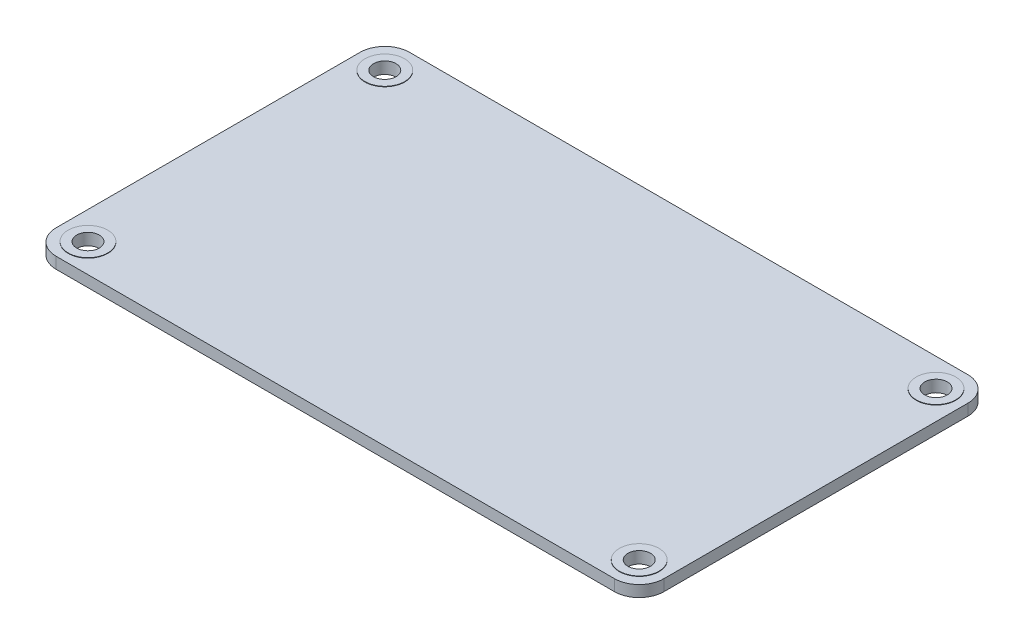
ISO-10303-21;
HEADER;
FILE_DESCRIPTION(('STEP AP214'),'2;1');
FILE_NAME('part.step','',(''),(''),'','','');
FILE_SCHEMA(('AUTOMOTIVE_DESIGN { 1 0 10303 214 1 1 1 1 }'));
ENDSEC;
DATA;
#1=APPLICATION_CONTEXT('core data for automotive mechanical design processes');
#2=APPLICATION_PROTOCOL_DEFINITION('international standard','automotive_design',2000,#1);
#3=PRODUCT_CONTEXT('',#1,'mechanical');
#4=PRODUCT('Part','Part','',(#3));
#5=PRODUCT_RELATED_PRODUCT_CATEGORY('part','',(#4));
#6=PRODUCT_DEFINITION_FORMATION('','',#4);
#7=PRODUCT_DEFINITION_CONTEXT('part definition',#1,'design');
#8=PRODUCT_DEFINITION('design','',#6,#7);
#9=PRODUCT_DEFINITION_SHAPE('','',#8);
#10=(LENGTH_UNIT() NAMED_UNIT(*) SI_UNIT(.MILLI.,.METRE.));
#11=(NAMED_UNIT(*) PLANE_ANGLE_UNIT() SI_UNIT($,.RADIAN.));
#12=(NAMED_UNIT(*) SI_UNIT($,.STERADIAN.) SOLID_ANGLE_UNIT());
#13=UNCERTAINTY_MEASURE_WITH_UNIT(LENGTH_MEASURE(1.E-05),#10,'distance_accuracy_value','');
#14=(GEOMETRIC_REPRESENTATION_CONTEXT(3) GLOBAL_UNCERTAINTY_ASSIGNED_CONTEXT((#13)) GLOBAL_UNIT_ASSIGNED_CONTEXT((#10,
#11,#12)) REPRESENTATION_CONTEXT('',''));
#15=CARTESIAN_POINT('',(0.,0.,0.));
#16=DIRECTION('',(0.,0.,1.));
#17=DIRECTION('',(1.,0.,0.));
#18=AXIS2_PLACEMENT_3D('',#15,#16,#17);
#19=CARTESIAN_POINT('',(43.,1.6,25.));
#20=DIRECTION('',(-1.,0.,0.));
#21=DIRECTION('',(0.,0.,1.));
#22=AXIS2_PLACEMENT_3D('',#19,#20,#21);
#23=PLANE('',#22);
#24=DIRECTION('',(0.,0.,-1.));
#25=VECTOR('',#24,1.);
#26=CARTESIAN_POINT('',(43.,0.,25.));
#27=LINE('',#26,#25);
#28=CARTESIAN_POINT('',(43.,0.,21.5));
#29=VERTEX_POINT('',#28);
#30=CARTESIAN_POINT('',(43.,0.,-21.5));
#31=VERTEX_POINT('',#30);
#32=EDGE_CURVE('E131',#29,#31,#27,.T.);
#33=ORIENTED_EDGE('',*,*,#32,.T.);
#34=DIRECTION('',(0.,-1.,0.));
#35=VECTOR('',#34,1.);
#36=CARTESIAN_POINT('',(43.,1.6,-21.5));
#37=LINE('',#36,#35);
#38=CARTESIAN_POINT('',(43.,1.6,-21.5));
#39=VERTEX_POINT('',#38);
#40=EDGE_CURVE('E166',#31,#39,#37,.F.);
#41=ORIENTED_EDGE('',*,*,#40,.T.);
#42=DIRECTION('',(0.,0.,-1.));
#43=VECTOR('',#42,1.);
#44=CARTESIAN_POINT('',(43.,1.6,25.));
#45=LINE('',#44,#43);
#46=CARTESIAN_POINT('',(43.,1.6,21.5));
#47=VERTEX_POINT('',#46);
#48=EDGE_CURVE('E129',#47,#39,#45,.T.);
#49=ORIENTED_EDGE('',*,*,#48,.F.);
#50=DIRECTION('',(0.,-1.,0.));
#51=VECTOR('',#50,1.);
#52=CARTESIAN_POINT('',(43.,1.6,21.5));
#53=LINE('',#52,#51);
#54=EDGE_CURVE('E163',#47,#29,#53,.T.);
#55=ORIENTED_EDGE('',*,*,#54,.T.);
#56=EDGE_LOOP('',(#33,#41,#49,#55));
#57=FACE_BOUND('',#56,.T.);
#58=ADVANCED_FACE('F36',(#57),#23,.F.);
#59=CARTESIAN_POINT('',(-43.,1.6,-25.));
#60=DIRECTION('',(0.,0.,1.));
#61=DIRECTION('',(1.,0.,0.));
#62=AXIS2_PLACEMENT_3D('',#59,#60,#61);
#63=PLANE('',#62);
#64=DIRECTION('',(-1.,0.,0.));
#65=VECTOR('',#64,1.);
#66=CARTESIAN_POINT('',(-43.,0.,-25.));
#67=LINE('',#66,#65);
#68=CARTESIAN_POINT('',(39.5,0.,-25.));
#69=VERTEX_POINT('',#68);
#70=CARTESIAN_POINT('',(-39.5,0.,-25.));
#71=VERTEX_POINT('',#70);
#72=EDGE_CURVE('E127',#69,#71,#67,.T.);
#73=ORIENTED_EDGE('',*,*,#72,.T.);
#74=DIRECTION('',(0.,-1.,0.));
#75=VECTOR('',#74,1.);
#76=CARTESIAN_POINT('',(-39.5,1.6,-25.));
#77=LINE('',#76,#75);
#78=CARTESIAN_POINT('',(-39.5,1.6,-25.));
#79=VERTEX_POINT('',#78);
#80=EDGE_CURVE('E106',#71,#79,#77,.F.);
#81=ORIENTED_EDGE('',*,*,#80,.T.);
#82=DIRECTION('',(-1.,0.,0.));
#83=VECTOR('',#82,1.);
#84=CARTESIAN_POINT('',(-43.,1.6,-25.));
#85=LINE('',#84,#83);
#86=CARTESIAN_POINT('',(39.5,1.6,-25.));
#87=VERTEX_POINT('',#86);
#88=EDGE_CURVE('E182',#87,#79,#85,.T.);
#89=ORIENTED_EDGE('',*,*,#88,.F.);
#90=DIRECTION('',(0.,-1.,0.));
#91=VECTOR('',#90,1.);
#92=CARTESIAN_POINT('',(39.5,1.6,-25.));
#93=LINE('',#92,#91);
#94=EDGE_CURVE('E111',#87,#69,#93,.T.);
#95=ORIENTED_EDGE('',*,*,#94,.T.);
#96=EDGE_LOOP('',(#73,#81,#89,#95));
#97=FACE_BOUND('',#96,.T.);
#98=ADVANCED_FACE('F251',(#97),#63,.F.);
#99=CARTESIAN_POINT('',(-43.,1.6,25.));
#100=DIRECTION('',(1.,0.,0.));
#101=DIRECTION('',(0.,0.,-1.));
#102=AXIS2_PLACEMENT_3D('',#99,#100,#101);
#103=PLANE('',#102);
#104=DIRECTION('',(0.,0.,1.));
#105=VECTOR('',#104,1.);
#106=CARTESIAN_POINT('',(-43.,1.6,25.));
#107=LINE('',#106,#105);
#108=CARTESIAN_POINT('',(-43.,1.6,-21.5));
#109=VERTEX_POINT('',#108);
#110=CARTESIAN_POINT('',(-43.,1.6,21.5));
#111=VERTEX_POINT('',#110);
#112=EDGE_CURVE('E120',#109,#111,#107,.T.);
#113=ORIENTED_EDGE('',*,*,#112,.F.);
#114=DIRECTION('',(0.,-1.,0.));
#115=VECTOR('',#114,1.);
#116=CARTESIAN_POINT('',(-43.,1.6,-21.5));
#117=LINE('',#116,#115);
#118=CARTESIAN_POINT('',(-43.,0.,-21.5));
#119=VERTEX_POINT('',#118);
#120=EDGE_CURVE('E105',#109,#119,#117,.T.);
#121=ORIENTED_EDGE('',*,*,#120,.T.);
#122=DIRECTION('',(0.,0.,1.));
#123=VECTOR('',#122,1.);
#124=CARTESIAN_POINT('',(-43.,0.,25.));
#125=LINE('',#124,#123);
#126=CARTESIAN_POINT('',(-43.,0.,21.5));
#127=VERTEX_POINT('',#126);
#128=EDGE_CURVE('E118',#119,#127,#125,.T.);
#129=ORIENTED_EDGE('',*,*,#128,.T.);
#130=DIRECTION('',(0.,-1.,0.));
#131=VECTOR('',#130,1.);
#132=CARTESIAN_POINT('',(-43.,1.6,21.5));
#133=LINE('',#132,#131);
#134=EDGE_CURVE('E122',#127,#111,#133,.F.);
#135=ORIENTED_EDGE('',*,*,#134,.T.);
#136=EDGE_LOOP('',(#113,#121,#129,#135));
#137=FACE_BOUND('',#136,.T.);
#138=ADVANCED_FACE('F117',(#137),#103,.F.);
#139=CARTESIAN_POINT('',(-43.,1.6,25.));
#140=DIRECTION('',(0.,0.,-1.));
#141=DIRECTION('',(-1.,0.,0.));
#142=AXIS2_PLACEMENT_3D('',#139,#140,#141);
#143=PLANE('',#142);
#144=DIRECTION('',(1.,0.,0.));
#145=VECTOR('',#144,1.);
#146=CARTESIAN_POINT('',(-43.,0.,25.));
#147=LINE('',#146,#145);
#148=CARTESIAN_POINT('',(-39.5,0.,25.));
#149=VERTEX_POINT('',#148);
#150=CARTESIAN_POINT('',(39.5,0.,25.));
#151=VERTEX_POINT('',#150);
#152=EDGE_CURVE('E126',#149,#151,#147,.T.);
#153=ORIENTED_EDGE('',*,*,#152,.T.);
#154=DIRECTION('',(0.,-1.,0.));
#155=VECTOR('',#154,1.);
#156=CARTESIAN_POINT('',(39.5,1.6,25.));
#157=LINE('',#156,#155);
#158=CARTESIAN_POINT('',(39.5,1.6,25.));
#159=VERTEX_POINT('',#158);
#160=EDGE_CURVE('E11',#151,#159,#157,.F.);
#161=ORIENTED_EDGE('',*,*,#160,.T.);
#162=DIRECTION('',(1.,0.,0.));
#163=VECTOR('',#162,1.);
#164=CARTESIAN_POINT('',(-43.,1.6,25.));
#165=LINE('',#164,#163);
#166=CARTESIAN_POINT('',(-39.5,1.6,25.));
#167=VERTEX_POINT('',#166);
#168=EDGE_CURVE('E139',#167,#159,#165,.T.);
#169=ORIENTED_EDGE('',*,*,#168,.F.);
#170=DIRECTION('',(0.,-1.,0.));
#171=VECTOR('',#170,1.);
#172=CARTESIAN_POINT('',(-39.5,1.6,25.));
#173=LINE('',#172,#171);
#174=EDGE_CURVE('E44',#167,#149,#173,.T.);
#175=ORIENTED_EDGE('',*,*,#174,.T.);
#176=EDGE_LOOP('',(#153,#161,#169,#175));
#177=FACE_BOUND('',#176,.T.);
#178=ADVANCED_FACE('F169',(#177),#143,.F.);
#179=CARTESIAN_POINT('',(0.,1.6,0.));
#180=DIRECTION('',(0.,-1.,0.));
#181=DIRECTION('',(0.,0.,-1.));
#182=AXIS2_PLACEMENT_3D('',#179,#180,#181);
#183=PLANE('',#182);
#184=CARTESIAN_POINT('',(-38.9999999999996,1.6,21.));
#185=DIRECTION('',(0.,-1.,0.));
#186=DIRECTION('',(0.,0.,-1.));
#187=AXIS2_PLACEMENT_3D('',#184,#185,#186);
#188=CIRCLE('',#187,2.8);
#189=CARTESIAN_POINT('',(-38.9999999999996,1.6,18.2));
#190=VERTEX_POINT('',#189);
#191=EDGE_CURVE('E145',#190,#190,#188,.F.);
#192=ORIENTED_EDGE('',*,*,#191,.F.);
#193=EDGE_LOOP('',(#192));
#194=FACE_BOUND('',#193,.T.);
#195=CARTESIAN_POINT('',(39.0000000000004,1.6,21.));
#196=DIRECTION('',(0.,-1.,0.));
#197=DIRECTION('',(0.,0.,-1.));
#198=AXIS2_PLACEMENT_3D('',#195,#196,#197);
#199=CIRCLE('',#198,2.8);
#200=CARTESIAN_POINT('',(39.0000000000004,1.6,18.2));
#201=VERTEX_POINT('',#200);
#202=EDGE_CURVE('E142',#201,#201,#199,.F.);
#203=ORIENTED_EDGE('',*,*,#202,.F.);
#204=EDGE_LOOP('',(#203));
#205=FACE_BOUND('',#204,.T.);
#206=CARTESIAN_POINT('',(39.,1.6,-21.));
#207=DIRECTION('',(0.,-1.,0.));
#208=DIRECTION('',(0.,0.,-1.));
#209=AXIS2_PLACEMENT_3D('',#206,#207,#208);
#210=CIRCLE('',#209,2.8);
#211=CARTESIAN_POINT('',(39.,1.6,-23.8));
#212=VERTEX_POINT('',#211);
#213=EDGE_CURVE('E138',#212,#212,#210,.F.);
#214=ORIENTED_EDGE('',*,*,#213,.F.);
#215=EDGE_LOOP('',(#214));
#216=FACE_BOUND('',#215,.T.);
#217=CARTESIAN_POINT('',(-39.,1.6,-21.));
#218=DIRECTION('',(0.,-1.,0.));
#219=DIRECTION('',(0.,0.,-1.));
#220=AXIS2_PLACEMENT_3D('',#217,#218,#219);
#221=CIRCLE('',#220,2.8);
#222=CARTESIAN_POINT('',(-39.,1.6,-23.8));
#223=VERTEX_POINT('',#222);
#224=EDGE_CURVE('E135',#223,#223,#221,.F.);
#225=ORIENTED_EDGE('',*,*,#224,.F.);
#226=EDGE_LOOP('',(#225));
#227=FACE_BOUND('',#226,.T.);
#228=ORIENTED_EDGE('',*,*,#88,.T.);
#229=CARTESIAN_POINT('',(-39.5,1.6,-21.5));
#230=DIRECTION('',(0.,-1.,0.));
#231=DIRECTION('',(0.,0.,-1.));
#232=AXIS2_PLACEMENT_3D('',#229,#230,#231);
#233=CIRCLE('',#232,3.5);
#234=EDGE_CURVE('E161',#79,#109,#233,.F.);
#235=ORIENTED_EDGE('',*,*,#234,.T.);
#236=ORIENTED_EDGE('',*,*,#112,.T.);
#237=CARTESIAN_POINT('',(-39.5,1.6,21.5));
#238=DIRECTION('',(0.,-1.,0.));
#239=DIRECTION('',(0.,0.,-1.));
#240=AXIS2_PLACEMENT_3D('',#237,#238,#239);
#241=CIRCLE('',#240,3.5);
#242=EDGE_CURVE('E56',#111,#167,#241,.F.);
#243=ORIENTED_EDGE('',*,*,#242,.T.);
#244=ORIENTED_EDGE('',*,*,#168,.T.);
#245=CARTESIAN_POINT('',(39.5,1.6,21.5));
#246=DIRECTION('',(0.,-1.,0.));
#247=DIRECTION('',(0.,0.,-1.));
#248=AXIS2_PLACEMENT_3D('',#245,#246,#247);
#249=CIRCLE('',#248,3.5);
#250=EDGE_CURVE('E157',#159,#47,#249,.F.);
#251=ORIENTED_EDGE('',*,*,#250,.T.);
#252=ORIENTED_EDGE('',*,*,#48,.T.);
#253=CARTESIAN_POINT('',(39.5,1.6,-21.5));
#254=DIRECTION('',(0.,-1.,0.));
#255=DIRECTION('',(0.,0.,-1.));
#256=AXIS2_PLACEMENT_3D('',#253,#254,#255);
#257=CIRCLE('',#256,3.5);
#258=EDGE_CURVE('E159',#39,#87,#257,.F.);
#259=ORIENTED_EDGE('',*,*,#258,.T.);
#260=EDGE_LOOP('',(#228,#235,#236,#243,#244,#251,#252,#259));
#261=FACE_BOUND('',#260,.T.);
#262=ADVANCED_FACE('F272',(#194,#205,#216,#227,#261),#183,.F.);
#263=CARTESIAN_POINT('',(0.,0.,0.));
#264=DIRECTION('',(0.,-1.,0.));
#265=DIRECTION('',(0.,0.,-1.));
#266=AXIS2_PLACEMENT_3D('',#263,#264,#265);
#267=PLANE('',#266);
#268=CARTESIAN_POINT('',(-38.9999999999996,0.,21.));
#269=DIRECTION('',(0.,1.,0.));
#270=DIRECTION('',(0.,0.,1.));
#271=AXIS2_PLACEMENT_3D('',#268,#269,#270);
#272=CIRCLE('',#271,1.6);
#273=CARTESIAN_POINT('',(-38.9999999999996,0.,22.6));
#274=VERTEX_POINT('',#273);
#275=EDGE_CURVE('E221',#274,#274,#272,.T.);
#276=ORIENTED_EDGE('',*,*,#275,.T.);
#277=EDGE_LOOP('',(#276));
#278=FACE_BOUND('',#277,.T.);
#279=CARTESIAN_POINT('',(39.0000000000004,0.,21.));
#280=DIRECTION('',(0.,1.,0.));
#281=DIRECTION('',(0.,0.,1.));
#282=AXIS2_PLACEMENT_3D('',#279,#280,#281);
#283=CIRCLE('',#282,1.6);
#284=CARTESIAN_POINT('',(39.0000000000004,0.,22.6));
#285=VERTEX_POINT('',#284);
#286=EDGE_CURVE('E224',#285,#285,#283,.T.);
#287=ORIENTED_EDGE('',*,*,#286,.T.);
#288=EDGE_LOOP('',(#287));
#289=FACE_BOUND('',#288,.T.);
#290=CARTESIAN_POINT('',(39.,0.,-21.));
#291=DIRECTION('',(0.,1.,0.));
#292=DIRECTION('',(0.,0.,1.));
#293=AXIS2_PLACEMENT_3D('',#290,#291,#292);
#294=CIRCLE('',#293,1.6);
#295=CARTESIAN_POINT('',(39.,0.,-19.4));
#296=VERTEX_POINT('',#295);
#297=EDGE_CURVE('E220',#296,#296,#294,.T.);
#298=ORIENTED_EDGE('',*,*,#297,.T.);
#299=EDGE_LOOP('',(#298));
#300=FACE_BOUND('',#299,.T.);
#301=CARTESIAN_POINT('',(-39.,0.,-21.));
#302=DIRECTION('',(0.,1.,0.));
#303=DIRECTION('',(0.,0.,1.));
#304=AXIS2_PLACEMENT_3D('',#301,#302,#303);
#305=CIRCLE('',#304,1.6);
#306=CARTESIAN_POINT('',(-39.,0.,-19.4));
#307=VERTEX_POINT('',#306);
#308=EDGE_CURVE('E217',#307,#307,#305,.T.);
#309=ORIENTED_EDGE('',*,*,#308,.T.);
#310=EDGE_LOOP('',(#309));
#311=FACE_BOUND('',#310,.T.);
#312=ORIENTED_EDGE('',*,*,#128,.F.);
#313=CARTESIAN_POINT('',(-39.5,0.,-21.5));
#314=DIRECTION('',(0.,-1.,0.));
#315=DIRECTION('',(0.,0.,-1.));
#316=AXIS2_PLACEMENT_3D('',#313,#314,#315);
#317=CIRCLE('',#316,3.5);
#318=EDGE_CURVE('E101',#119,#71,#317,.T.);
#319=ORIENTED_EDGE('',*,*,#318,.T.);
#320=ORIENTED_EDGE('',*,*,#72,.F.);
#321=CARTESIAN_POINT('',(39.5,0.,-21.5));
#322=DIRECTION('',(0.,-1.,0.));
#323=DIRECTION('',(0.,0.,-1.));
#324=AXIS2_PLACEMENT_3D('',#321,#322,#323);
#325=CIRCLE('',#324,3.5);
#326=EDGE_CURVE('E112',#69,#31,#325,.T.);
#327=ORIENTED_EDGE('',*,*,#326,.T.);
#328=ORIENTED_EDGE('',*,*,#32,.F.);
#329=CARTESIAN_POINT('',(39.5,0.,21.5));
#330=DIRECTION('',(0.,-1.,0.));
#331=DIRECTION('',(0.,0.,-1.));
#332=AXIS2_PLACEMENT_3D('',#329,#330,#331);
#333=CIRCLE('',#332,3.5);
#334=EDGE_CURVE('E150',#29,#151,#333,.T.);
#335=ORIENTED_EDGE('',*,*,#334,.T.);
#336=ORIENTED_EDGE('',*,*,#152,.F.);
#337=CARTESIAN_POINT('',(-39.5,0.,21.5));
#338=DIRECTION('',(0.,-1.,0.));
#339=DIRECTION('',(0.,0.,-1.));
#340=AXIS2_PLACEMENT_3D('',#337,#338,#339);
#341=CIRCLE('',#340,3.5);
#342=EDGE_CURVE('E121',#149,#127,#341,.T.);
#343=ORIENTED_EDGE('',*,*,#342,.T.);
#344=EDGE_LOOP('',(#312,#319,#320,#327,#328,#335,#336,#343));
#345=FACE_BOUND('',#344,.T.);
#346=ADVANCED_FACE('F124',(#278,#289,#300,#311,#345),#267,.T.);
#347=CARTESIAN_POINT('',(-39.,1.66,-21.));
#348=DIRECTION('',(0.,1.,0.));
#349=DIRECTION('',(0.,0.,1.));
#350=AXIS2_PLACEMENT_3D('',#347,#348,#349);
#351=PLANE('',#350);
#352=CARTESIAN_POINT('',(-39.,1.66,-21.));
#353=DIRECTION('',(0.,1.,0.));
#354=DIRECTION('',(0.,0.,1.));
#355=AXIS2_PLACEMENT_3D('',#352,#353,#354);
#356=CIRCLE('',#355,2.8);
#357=CARTESIAN_POINT('',(-39.,1.66,-18.2));
#358=VERTEX_POINT('',#357);
#359=EDGE_CURVE('E187',#358,#358,#356,.T.);
#360=ORIENTED_EDGE('',*,*,#359,.T.);
#361=EDGE_LOOP('',(#360));
#362=FACE_BOUND('',#361,.T.);
#363=CARTESIAN_POINT('',(-39.,1.66,-21.));
#364=DIRECTION('',(0.,1.,0.));
#365=DIRECTION('',(0.,0.,1.));
#366=AXIS2_PLACEMENT_3D('',#363,#364,#365);
#367=CIRCLE('',#366,1.6);
#368=CARTESIAN_POINT('',(-39.,1.66,-19.4));
#369=VERTEX_POINT('',#368);
#370=EDGE_CURVE('E192',#369,#369,#367,.T.);
#371=ORIENTED_EDGE('',*,*,#370,.F.);
#372=EDGE_LOOP('',(#371));
#373=FACE_BOUND('',#372,.T.);
#374=ADVANCED_FACE('F282',(#362,#373),#351,.T.);
#375=CARTESIAN_POINT('',(-39.,1.66,-21.));
#376=DIRECTION('',(0.,-1.,0.));
#377=DIRECTION('',(0.,0.,-1.));
#378=AXIS2_PLACEMENT_3D('',#375,#376,#377);
#379=CYLINDRICAL_SURFACE('',#378,2.8);
#380=ORIENTED_EDGE('',*,*,#359,.F.);
#381=EDGE_LOOP('',(#380));
#382=FACE_BOUND('',#381,.T.);
#383=ORIENTED_EDGE('',*,*,#224,.T.);
#384=EDGE_LOOP('',(#383));
#385=FACE_BOUND('',#384,.T.);
#386=ADVANCED_FACE('F289',(#382,#385),#379,.T.);
#387=CARTESIAN_POINT('',(-39.,1.66,-21.));
#388=DIRECTION('',(0.,-1.,0.));
#389=DIRECTION('',(0.,0.,-1.));
#390=AXIS2_PLACEMENT_3D('',#387,#388,#389);
#391=CYLINDRICAL_SURFACE('',#390,1.6);
#392=ORIENTED_EDGE('',*,*,#370,.T.);
#393=EDGE_LOOP('',(#392));
#394=FACE_BOUND('',#393,.T.);
#395=ORIENTED_EDGE('',*,*,#308,.F.);
#396=EDGE_LOOP('',(#395));
#397=FACE_BOUND('',#396,.T.);
#398=ADVANCED_FACE('F392',(#394,#397),#391,.F.);
#399=CARTESIAN_POINT('',(39.,1.66,-21.));
#400=DIRECTION('',(0.,1.,0.));
#401=DIRECTION('',(0.,0.,1.));
#402=AXIS2_PLACEMENT_3D('',#399,#400,#401);
#403=PLANE('',#402);
#404=CARTESIAN_POINT('',(39.,1.66,-21.));
#405=DIRECTION('',(0.,1.,0.));
#406=DIRECTION('',(0.,0.,1.));
#407=AXIS2_PLACEMENT_3D('',#404,#405,#406);
#408=CIRCLE('',#407,2.8);
#409=CARTESIAN_POINT('',(39.,1.66,-18.2));
#410=VERTEX_POINT('',#409);
#411=EDGE_CURVE('E196',#410,#410,#408,.T.);
#412=ORIENTED_EDGE('',*,*,#411,.T.);
#413=EDGE_LOOP('',(#412));
#414=FACE_BOUND('',#413,.T.);
#415=CARTESIAN_POINT('',(39.,1.66,-21.));
#416=DIRECTION('',(0.,1.,0.));
#417=DIRECTION('',(0.,0.,1.));
#418=AXIS2_PLACEMENT_3D('',#415,#416,#417);
#419=CIRCLE('',#418,1.6);
#420=CARTESIAN_POINT('',(39.,1.66,-19.4));
#421=VERTEX_POINT('',#420);
#422=EDGE_CURVE('E200',#421,#421,#419,.T.);
#423=ORIENTED_EDGE('',*,*,#422,.F.);
#424=EDGE_LOOP('',(#423));
#425=FACE_BOUND('',#424,.T.);
#426=ADVANCED_FACE('F245',(#414,#425),#403,.T.);
#427=CARTESIAN_POINT('',(39.,1.66,-21.));
#428=DIRECTION('',(0.,-1.,0.));
#429=DIRECTION('',(0.,0.,-1.));
#430=AXIS2_PLACEMENT_3D('',#427,#428,#429);
#431=CYLINDRICAL_SURFACE('',#430,2.8);
#432=ORIENTED_EDGE('',*,*,#411,.F.);
#433=EDGE_LOOP('',(#432));
#434=FACE_BOUND('',#433,.T.);
#435=ORIENTED_EDGE('',*,*,#213,.T.);
#436=EDGE_LOOP('',(#435));
#437=FACE_BOUND('',#436,.T.);
#438=ADVANCED_FACE('F235',(#434,#437),#431,.T.);
#439=CARTESIAN_POINT('',(39.,1.66,-21.));
#440=DIRECTION('',(0.,-1.,0.));
#441=DIRECTION('',(0.,0.,-1.));
#442=AXIS2_PLACEMENT_3D('',#439,#440,#441);
#443=CYLINDRICAL_SURFACE('',#442,1.6);
#444=ORIENTED_EDGE('',*,*,#422,.T.);
#445=EDGE_LOOP('',(#444));
#446=FACE_BOUND('',#445,.T.);
#447=ORIENTED_EDGE('',*,*,#297,.F.);
#448=EDGE_LOOP('',(#447));
#449=FACE_BOUND('',#448,.T.);
#450=ADVANCED_FACE('F232',(#446,#449),#443,.F.);
#451=CARTESIAN_POINT('',(39.0000000000004,1.66,21.));
#452=DIRECTION('',(0.,1.,0.));
#453=DIRECTION('',(0.,0.,1.));
#454=AXIS2_PLACEMENT_3D('',#451,#452,#453);
#455=PLANE('',#454);
#456=CARTESIAN_POINT('',(39.0000000000004,1.66,21.));
#457=DIRECTION('',(0.,1.,0.));
#458=DIRECTION('',(0.,0.,1.));
#459=AXIS2_PLACEMENT_3D('',#456,#457,#458);
#460=CIRCLE('',#459,2.8);
#461=CARTESIAN_POINT('',(39.0000000000004,1.66,23.8));
#462=VERTEX_POINT('',#461);
#463=EDGE_CURVE('E205',#462,#462,#460,.T.);
#464=ORIENTED_EDGE('',*,*,#463,.T.);
#465=EDGE_LOOP('',(#464));
#466=FACE_BOUND('',#465,.T.);
#467=CARTESIAN_POINT('',(39.0000000000004,1.66,21.));
#468=DIRECTION('',(0.,1.,0.));
#469=DIRECTION('',(0.,0.,1.));
#470=AXIS2_PLACEMENT_3D('',#467,#468,#469);
#471=CIRCLE('',#470,1.6);
#472=CARTESIAN_POINT('',(39.0000000000004,1.66,22.6));
#473=VERTEX_POINT('',#472);
#474=EDGE_CURVE('E208',#473,#473,#471,.T.);
#475=ORIENTED_EDGE('',*,*,#474,.F.);
#476=EDGE_LOOP('',(#475));
#477=FACE_BOUND('',#476,.T.);
#478=ADVANCED_FACE('F234',(#466,#477),#455,.T.);
#479=CARTESIAN_POINT('',(39.0000000000004,1.66,21.));
#480=DIRECTION('',(0.,-1.,0.));
#481=DIRECTION('',(0.,0.,-1.));
#482=AXIS2_PLACEMENT_3D('',#479,#480,#481);
#483=CYLINDRICAL_SURFACE('',#482,2.8);
#484=ORIENTED_EDGE('',*,*,#463,.F.);
#485=EDGE_LOOP('',(#484));
#486=FACE_BOUND('',#485,.T.);
#487=ORIENTED_EDGE('',*,*,#202,.T.);
#488=EDGE_LOOP('',(#487));
#489=FACE_BOUND('',#488,.T.);
#490=ADVANCED_FACE('F242',(#486,#489),#483,.T.);
#491=CARTESIAN_POINT('',(39.0000000000004,1.66,21.));
#492=DIRECTION('',(0.,-1.,0.));
#493=DIRECTION('',(0.,0.,-1.));
#494=AXIS2_PLACEMENT_3D('',#491,#492,#493);
#495=CYLINDRICAL_SURFACE('',#494,1.6);
#496=ORIENTED_EDGE('',*,*,#474,.T.);
#497=EDGE_LOOP('',(#496));
#498=FACE_BOUND('',#497,.T.);
#499=ORIENTED_EDGE('',*,*,#286,.F.);
#500=EDGE_LOOP('',(#499));
#501=FACE_BOUND('',#500,.T.);
#502=ADVANCED_FACE('F358',(#498,#501),#495,.F.);
#503=CARTESIAN_POINT('',(-38.9999999999996,1.66,21.));
#504=DIRECTION('',(0.,1.,0.));
#505=DIRECTION('',(0.,0.,1.));
#506=AXIS2_PLACEMENT_3D('',#503,#504,#505);
#507=PLANE('',#506);
#508=CARTESIAN_POINT('',(-38.9999999999996,1.66,21.));
#509=DIRECTION('',(0.,1.,0.));
#510=DIRECTION('',(0.,0.,1.));
#511=AXIS2_PLACEMENT_3D('',#508,#509,#510);
#512=CIRCLE('',#511,2.8);
#513=CARTESIAN_POINT('',(-38.9999999999996,1.66,23.8));
#514=VERTEX_POINT('',#513);
#515=EDGE_CURVE('E211',#514,#514,#512,.T.);
#516=ORIENTED_EDGE('',*,*,#515,.T.);
#517=EDGE_LOOP('',(#516));
#518=FACE_BOUND('',#517,.T.);
#519=CARTESIAN_POINT('',(-38.9999999999996,1.66,21.));
#520=DIRECTION('',(0.,1.,0.));
#521=DIRECTION('',(0.,0.,1.));
#522=AXIS2_PLACEMENT_3D('',#519,#520,#521);
#523=CIRCLE('',#522,1.6);
#524=CARTESIAN_POINT('',(-38.9999999999996,1.66,22.6));
#525=VERTEX_POINT('',#524);
#526=EDGE_CURVE('E214',#525,#525,#523,.T.);
#527=ORIENTED_EDGE('',*,*,#526,.F.);
#528=EDGE_LOOP('',(#527));
#529=FACE_BOUND('',#528,.T.);
#530=ADVANCED_FACE('F349',(#518,#529),#507,.T.);
#531=CARTESIAN_POINT('',(-38.9999999999996,1.66,21.));
#532=DIRECTION('',(0.,-1.,0.));
#533=DIRECTION('',(0.,0.,-1.));
#534=AXIS2_PLACEMENT_3D('',#531,#532,#533);
#535=CYLINDRICAL_SURFACE('',#534,2.8);
#536=ORIENTED_EDGE('',*,*,#515,.F.);
#537=EDGE_LOOP('',(#536));
#538=FACE_BOUND('',#537,.T.);
#539=ORIENTED_EDGE('',*,*,#191,.T.);
#540=EDGE_LOOP('',(#539));
#541=FACE_BOUND('',#540,.T.);
#542=ADVANCED_FACE('F341',(#538,#541),#535,.T.);
#543=CARTESIAN_POINT('',(-38.9999999999996,1.66,21.));
#544=DIRECTION('',(0.,-1.,0.));
#545=DIRECTION('',(0.,0.,-1.));
#546=AXIS2_PLACEMENT_3D('',#543,#544,#545);
#547=CYLINDRICAL_SURFACE('',#546,1.6);
#548=ORIENTED_EDGE('',*,*,#526,.T.);
#549=EDGE_LOOP('',(#548));
#550=FACE_BOUND('',#549,.T.);
#551=ORIENTED_EDGE('',*,*,#275,.F.);
#552=EDGE_LOOP('',(#551));
#553=FACE_BOUND('',#552,.T.);
#554=ADVANCED_FACE('F263',(#550,#553),#547,.F.);
#555=CARTESIAN_POINT('',(-39.5,1.6,-21.5));
#556=DIRECTION('',(0.,-1.,0.));
#557=DIRECTION('',(0.,0.,-1.));
#558=AXIS2_PLACEMENT_3D('',#555,#556,#557);
#559=CYLINDRICAL_SURFACE('',#558,3.5);
#560=ORIENTED_EDGE('',*,*,#234,.F.);
#561=ORIENTED_EDGE('',*,*,#80,.F.);
#562=ORIENTED_EDGE('',*,*,#318,.F.);
#563=ORIENTED_EDGE('',*,*,#120,.F.);
#564=EDGE_LOOP('',(#560,#561,#562,#563));
#565=FACE_BOUND('',#564,.T.);
#566=ADVANCED_FACE('F104',(#565),#559,.T.);
#567=CARTESIAN_POINT('',(39.5,1.6,-21.5));
#568=DIRECTION('',(0.,-1.,0.));
#569=DIRECTION('',(0.,0.,-1.));
#570=AXIS2_PLACEMENT_3D('',#567,#568,#569);
#571=CYLINDRICAL_SURFACE('',#570,3.5);
#572=ORIENTED_EDGE('',*,*,#258,.F.);
#573=ORIENTED_EDGE('',*,*,#40,.F.);
#574=ORIENTED_EDGE('',*,*,#326,.F.);
#575=ORIENTED_EDGE('',*,*,#94,.F.);
#576=EDGE_LOOP('',(#572,#573,#574,#575));
#577=FACE_BOUND('',#576,.T.);
#578=ADVANCED_FACE('F262',(#577),#571,.T.);
#579=CARTESIAN_POINT('',(39.5,1.6,21.5));
#580=DIRECTION('',(0.,-1.,0.));
#581=DIRECTION('',(0.,0.,-1.));
#582=AXIS2_PLACEMENT_3D('',#579,#580,#581);
#583=CYLINDRICAL_SURFACE('',#582,3.5);
#584=ORIENTED_EDGE('',*,*,#250,.F.);
#585=ORIENTED_EDGE('',*,*,#160,.F.);
#586=ORIENTED_EDGE('',*,*,#334,.F.);
#587=ORIENTED_EDGE('',*,*,#54,.F.);
#588=EDGE_LOOP('',(#584,#585,#586,#587));
#589=FACE_BOUND('',#588,.T.);
#590=ADVANCED_FACE('F176',(#589),#583,.T.);
#591=CARTESIAN_POINT('',(-39.5,1.6,21.5));
#592=DIRECTION('',(0.,-1.,0.));
#593=DIRECTION('',(0.,0.,-1.));
#594=AXIS2_PLACEMENT_3D('',#591,#592,#593);
#595=CYLINDRICAL_SURFACE('',#594,3.5);
#596=ORIENTED_EDGE('',*,*,#242,.F.);
#597=ORIENTED_EDGE('',*,*,#134,.F.);
#598=ORIENTED_EDGE('',*,*,#342,.F.);
#599=ORIENTED_EDGE('',*,*,#174,.F.);
#600=EDGE_LOOP('',(#596,#597,#598,#599));
#601=FACE_BOUND('',#600,.T.);
#602=ADVANCED_FACE('F38',(#601),#595,.T.);
#603=CLOSED_SHELL('',(#58,#98,#138,#178,#262,#346,#374,#386,#398,#426,#438,#450,#478,#490,#502,
#530,#542,#554,#566,#578,#590,#602));
#604=MANIFOLD_SOLID_BREP('B2',#603);
#605=ADVANCED_BREP_SHAPE_REPRESENTATION('',(#18,#604),#14);
#606=SHAPE_DEFINITION_REPRESENTATION(#9,#605);
ENDSEC;
END-ISO-10303-21;
